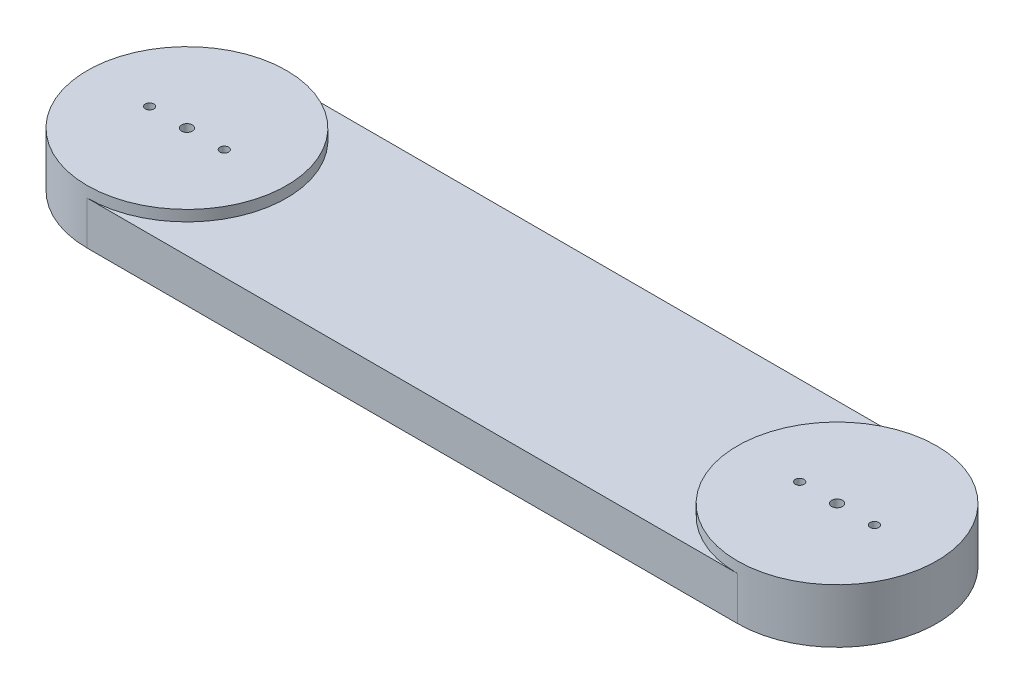
ISO-10303-21;
HEADER;
FILE_DESCRIPTION(('STEP AP214'),'2;1');
FILE_NAME('part.step','',(''),(''),'','','');
FILE_SCHEMA(('AUTOMOTIVE_DESIGN { 1 0 10303 214 1 1 1 1 }'));
ENDSEC;
DATA;
#1=APPLICATION_CONTEXT('core data for automotive mechanical design processes');
#2=APPLICATION_PROTOCOL_DEFINITION('international standard','automotive_design',2000,#1);
#3=PRODUCT_CONTEXT('',#1,'mechanical');
#4=PRODUCT('Part','Part','',(#3));
#5=PRODUCT_RELATED_PRODUCT_CATEGORY('part','',(#4));
#6=PRODUCT_DEFINITION_FORMATION('','',#4);
#7=PRODUCT_DEFINITION_CONTEXT('part definition',#1,'design');
#8=PRODUCT_DEFINITION('design','',#6,#7);
#9=PRODUCT_DEFINITION_SHAPE('','',#8);
#10=(LENGTH_UNIT() NAMED_UNIT(*) SI_UNIT(.MILLI.,.METRE.));
#11=(NAMED_UNIT(*) PLANE_ANGLE_UNIT() SI_UNIT($,.RADIAN.));
#12=(NAMED_UNIT(*) SI_UNIT($,.STERADIAN.) SOLID_ANGLE_UNIT());
#13=UNCERTAINTY_MEASURE_WITH_UNIT(LENGTH_MEASURE(1.E-05),#10,'distance_accuracy_value','');
#14=(GEOMETRIC_REPRESENTATION_CONTEXT(3) GLOBAL_UNCERTAINTY_ASSIGNED_CONTEXT((#13)) GLOBAL_UNIT_ASSIGNED_CONTEXT((#10,
#11,#12)) REPRESENTATION_CONTEXT('',''));
#15=CARTESIAN_POINT('',(0.,0.,0.));
#16=DIRECTION('',(0.,0.,1.));
#17=DIRECTION('',(1.,0.,0.));
#18=AXIS2_PLACEMENT_3D('',#15,#16,#17);
#19=CARTESIAN_POINT('',(-150.,0.,0.));
#20=DIRECTION('',(0.,1.,0.));
#21=DIRECTION('',(0.,0.,1.));
#22=AXIS2_PLACEMENT_3D('',#19,#20,#21);
#23=CYLINDRICAL_SURFACE('',#22,2.5);
#24=CARTESIAN_POINT('',(-150.,25.,0.));
#25=DIRECTION('',(0.,1.,0.));
#26=DIRECTION('',(0.,0.,1.));
#27=AXIS2_PLACEMENT_3D('',#24,#25,#26);
#28=CIRCLE('',#27,2.5);
#29=CARTESIAN_POINT('',(-150.,25.,2.49999999999997));
#30=VERTEX_POINT('',#29);
#31=EDGE_CURVE('E155',#30,#30,#28,.T.);
#32=ORIENTED_EDGE('',*,*,#31,.T.);
#33=EDGE_LOOP('',(#32));
#34=FACE_BOUND('',#33,.T.);
#35=CARTESIAN_POINT('',(-150.,6.6,0.));
#36=DIRECTION('',(0.,-1.,0.));
#37=DIRECTION('',(0.,0.,-1.));
#38=AXIS2_PLACEMENT_3D('',#35,#36,#37);
#39=CIRCLE('',#38,2.5);
#40=CARTESIAN_POINT('',(-150.,6.6,-2.50000000000002));
#41=VERTEX_POINT('',#40);
#42=EDGE_CURVE('E174',#41,#41,#39,.F.);
#43=ORIENTED_EDGE('',*,*,#42,.F.);
#44=EDGE_LOOP('',(#43));
#45=FACE_BOUND('',#44,.T.);
#46=ADVANCED_FACE('F43',(#34,#45),#23,.F.);
#47=CARTESIAN_POINT('',(-132.75,0.,0.));
#48=DIRECTION('',(0.,1.,0.));
#49=DIRECTION('',(0.,0.,1.));
#50=AXIS2_PLACEMENT_3D('',#47,#48,#49);
#51=CYLINDRICAL_SURFACE('',#50,2.);
#52=CARTESIAN_POINT('',(-132.75,25.,0.));
#53=DIRECTION('',(0.,1.,0.));
#54=DIRECTION('',(0.,0.,1.));
#55=AXIS2_PLACEMENT_3D('',#52,#53,#54);
#56=CIRCLE('',#55,2.);
#57=CARTESIAN_POINT('',(-132.75,25.,1.99999999999999));
#58=VERTEX_POINT('',#57);
#59=EDGE_CURVE('E169',#58,#58,#56,.T.);
#60=ORIENTED_EDGE('',*,*,#59,.T.);
#61=EDGE_LOOP('',(#60));
#62=FACE_BOUND('',#61,.T.);
#63=CARTESIAN_POINT('',(-132.75,6.6,0.));
#64=DIRECTION('',(0.,-1.,0.));
#65=DIRECTION('',(0.,0.,-1.));
#66=AXIS2_PLACEMENT_3D('',#63,#64,#65);
#67=CIRCLE('',#66,2.);
#68=CARTESIAN_POINT('',(-132.75,6.6,-2.));
#69=VERTEX_POINT('',#68);
#70=EDGE_CURVE('E181',#69,#69,#67,.F.);
#71=ORIENTED_EDGE('',*,*,#70,.F.);
#72=EDGE_LOOP('',(#71));
#73=FACE_BOUND('',#72,.T.);
#74=ADVANCED_FACE('F203',(#62,#73),#51,.F.);
#75=CARTESIAN_POINT('',(-167.25,0.,0.));
#76=DIRECTION('',(0.,1.,0.));
#77=DIRECTION('',(0.,0.,1.));
#78=AXIS2_PLACEMENT_3D('',#75,#76,#77);
#79=CYLINDRICAL_SURFACE('',#78,2.);
#80=CARTESIAN_POINT('',(-167.25,25.,0.));
#81=DIRECTION('',(0.,1.,0.));
#82=DIRECTION('',(0.,0.,1.));
#83=AXIS2_PLACEMENT_3D('',#80,#81,#82);
#84=CIRCLE('',#83,2.);
#85=CARTESIAN_POINT('',(-167.25,25.,2.));
#86=VERTEX_POINT('',#85);
#87=EDGE_CURVE('E170',#86,#86,#84,.T.);
#88=ORIENTED_EDGE('',*,*,#87,.T.);
#89=EDGE_LOOP('',(#88));
#90=FACE_BOUND('',#89,.T.);
#91=CARTESIAN_POINT('',(-167.25,6.6,0.));
#92=DIRECTION('',(0.,-1.,0.));
#93=DIRECTION('',(0.,0.,-1.));
#94=AXIS2_PLACEMENT_3D('',#91,#92,#93);
#95=CIRCLE('',#94,2.);
#96=CARTESIAN_POINT('',(-167.25,6.6,-2.));
#97=VERTEX_POINT('',#96);
#98=EDGE_CURVE('E47',#97,#97,#95,.F.);
#99=ORIENTED_EDGE('',*,*,#98,.F.);
#100=EDGE_LOOP('',(#99));
#101=FACE_BOUND('',#100,.T.);
#102=ADVANCED_FACE('F201',(#90,#101),#79,.F.);
#103=CARTESIAN_POINT('',(-150.,20.,-46.));
#104=DIRECTION('',(0.,0.,1.));
#105=DIRECTION('',(1.,0.,0.));
#106=AXIS2_PLACEMENT_3D('',#103,#104,#105);
#107=PLANE('',#106);
#108=DIRECTION('',(-1.,0.,0.));
#109=VECTOR('',#108,1.);
#110=CARTESIAN_POINT('',(-150.,0.,-46.));
#111=LINE('',#110,#109);
#112=CARTESIAN_POINT('',(150.,0.,-46.));
#113=VERTEX_POINT('',#112);
#114=CARTESIAN_POINT('',(-150.,0.,-46.));
#115=VERTEX_POINT('',#114);
#116=EDGE_CURVE('E96',#113,#115,#111,.T.);
#117=ORIENTED_EDGE('',*,*,#116,.T.);
#118=DIRECTION('',(0.,-1.,0.));
#119=VECTOR('',#118,1.);
#120=CARTESIAN_POINT('',(-150.,20.,-46.));
#121=LINE('',#120,#119);
#122=CARTESIAN_POINT('',(-150.,20.,-46.));
#123=VERTEX_POINT('',#122);
#124=EDGE_CURVE('E53',#123,#115,#121,.T.);
#125=ORIENTED_EDGE('',*,*,#124,.F.);
#126=DIRECTION('',(-1.,0.,0.));
#127=VECTOR('',#126,1.);
#128=CARTESIAN_POINT('',(-150.,20.,-46.));
#129=LINE('',#128,#127);
#130=CARTESIAN_POINT('',(150.,20.,-46.));
#131=VERTEX_POINT('',#130);
#132=EDGE_CURVE('E107',#131,#123,#129,.T.);
#133=ORIENTED_EDGE('',*,*,#132,.F.);
#134=DIRECTION('',(0.,-1.,0.));
#135=VECTOR('',#134,1.);
#136=CARTESIAN_POINT('',(150.,20.,-46.));
#137=LINE('',#136,#135);
#138=EDGE_CURVE('E11',#131,#113,#137,.T.);
#139=ORIENTED_EDGE('',*,*,#138,.T.);
#140=EDGE_LOOP('',(#117,#125,#133,#139));
#141=FACE_BOUND('',#140,.T.);
#142=ADVANCED_FACE('F45',(#141),#107,.F.);
#143=CARTESIAN_POINT('',(-150.,20.,46.));
#144=DIRECTION('',(0.,0.,-1.));
#145=DIRECTION('',(-1.,0.,0.));
#146=AXIS2_PLACEMENT_3D('',#143,#144,#145);
#147=PLANE('',#146);
#148=DIRECTION('',(1.,0.,0.));
#149=VECTOR('',#148,1.);
#150=CARTESIAN_POINT('',(-150.,0.,46.));
#151=LINE('',#150,#149);
#152=CARTESIAN_POINT('',(-150.,0.,46.));
#153=VERTEX_POINT('',#152);
#154=CARTESIAN_POINT('',(150.,0.,46.));
#155=VERTEX_POINT('',#154);
#156=EDGE_CURVE('E102',#153,#155,#151,.T.);
#157=ORIENTED_EDGE('',*,*,#156,.T.);
#158=DIRECTION('',(0.,-1.,0.));
#159=VECTOR('',#158,1.);
#160=CARTESIAN_POINT('',(150.,20.,46.));
#161=LINE('',#160,#159);
#162=CARTESIAN_POINT('',(150.,20.,46.));
#163=VERTEX_POINT('',#162);
#164=EDGE_CURVE('E86',#163,#155,#161,.T.);
#165=ORIENTED_EDGE('',*,*,#164,.F.);
#166=DIRECTION('',(1.,0.,0.));
#167=VECTOR('',#166,1.);
#168=CARTESIAN_POINT('',(-150.,20.,46.));
#169=LINE('',#168,#167);
#170=CARTESIAN_POINT('',(-150.,20.,46.));
#171=VERTEX_POINT('',#170);
#172=EDGE_CURVE('E110',#171,#163,#169,.T.);
#173=ORIENTED_EDGE('',*,*,#172,.F.);
#174=DIRECTION('',(0.,-1.,0.));
#175=VECTOR('',#174,1.);
#176=CARTESIAN_POINT('',(-150.,20.,46.));
#177=LINE('',#176,#175);
#178=EDGE_CURVE('E60',#171,#153,#177,.T.);
#179=ORIENTED_EDGE('',*,*,#178,.T.);
#180=EDGE_LOOP('',(#157,#165,#173,#179));
#181=FACE_BOUND('',#180,.T.);
#182=ADVANCED_FACE('F210',(#181),#147,.F.);
#183=CARTESIAN_POINT('',(0.,20.,0.));
#184=DIRECTION('',(0.,-1.,0.));
#185=DIRECTION('',(0.,0.,-1.));
#186=AXIS2_PLACEMENT_3D('',#183,#184,#185);
#187=PLANE('',#186);
#188=ORIENTED_EDGE('',*,*,#172,.T.);
#189=CARTESIAN_POINT('',(150.,20.,0.));
#190=DIRECTION('',(0.,-1.,0.));
#191=DIRECTION('',(0.,0.,-1.));
#192=AXIS2_PLACEMENT_3D('',#189,#190,#191);
#193=CIRCLE('',#192,46.);
#194=EDGE_CURVE('E91',#163,#131,#193,.T.);
#195=ORIENTED_EDGE('',*,*,#194,.T.);
#196=ORIENTED_EDGE('',*,*,#132,.T.);
#197=CARTESIAN_POINT('',(-150.,20.,0.));
#198=DIRECTION('',(0.,-1.,0.));
#199=DIRECTION('',(0.,0.,-1.));
#200=AXIS2_PLACEMENT_3D('',#197,#198,#199);
#201=CIRCLE('',#200,46.);
#202=EDGE_CURVE('E103',#123,#171,#201,.T.);
#203=ORIENTED_EDGE('',*,*,#202,.T.);
#204=EDGE_LOOP('',(#188,#195,#196,#203));
#205=FACE_BOUND('',#204,.T.);
#206=ADVANCED_FACE('F245',(#205),#187,.F.);
#207=CARTESIAN_POINT('',(0.,0.,0.));
#208=DIRECTION('',(0.,-1.,0.));
#209=DIRECTION('',(0.,0.,-1.));
#210=AXIS2_PLACEMENT_3D('',#207,#208,#209);
#211=PLANE('',#210);
#212=CARTESIAN_POINT('',(-150.,0.,0.));
#213=DIRECTION('',(0.,-1.,0.));
#214=DIRECTION('',(0.,0.,-1.));
#215=AXIS2_PLACEMENT_3D('',#212,#213,#214);
#216=CIRCLE('',#215,29.5);
#217=CARTESIAN_POINT('',(-150.,0.,-29.5));
#218=VERTEX_POINT('',#217);
#219=EDGE_CURVE('E185',#218,#218,#216,.T.);
#220=ORIENTED_EDGE('',*,*,#219,.F.);
#221=EDGE_LOOP('',(#220));
#222=FACE_BOUND('',#221,.T.);
#223=CARTESIAN_POINT('',(132.75,0.,0.));
#224=DIRECTION('',(0.,1.,0.));
#225=DIRECTION('',(0.,0.,1.));
#226=AXIS2_PLACEMENT_3D('',#223,#224,#225);
#227=CIRCLE('',#226,2.);
#228=CARTESIAN_POINT('',(132.75,0.,2.));
#229=VERTEX_POINT('',#228);
#230=EDGE_CURVE('E150',#229,#229,#227,.T.);
#231=ORIENTED_EDGE('',*,*,#230,.T.);
#232=EDGE_LOOP('',(#231));
#233=FACE_BOUND('',#232,.T.);
#234=CARTESIAN_POINT('',(167.25,0.,0.));
#235=DIRECTION('',(0.,1.,0.));
#236=DIRECTION('',(0.,0.,1.));
#237=AXIS2_PLACEMENT_3D('',#234,#235,#236);
#238=CIRCLE('',#237,2.);
#239=CARTESIAN_POINT('',(167.25,0.,1.99999999999999));
#240=VERTEX_POINT('',#239);
#241=EDGE_CURVE('E159',#240,#240,#238,.T.);
#242=ORIENTED_EDGE('',*,*,#241,.T.);
#243=EDGE_LOOP('',(#242));
#244=FACE_BOUND('',#243,.T.);
#245=CARTESIAN_POINT('',(150.,0.,0.));
#246=DIRECTION('',(0.,1.,0.));
#247=DIRECTION('',(0.,0.,1.));
#248=AXIS2_PLACEMENT_3D('',#245,#246,#247);
#249=CIRCLE('',#248,2.5);
#250=CARTESIAN_POINT('',(150.,0.,2.49999999999997));
#251=VERTEX_POINT('',#250);
#252=EDGE_CURVE('E140',#251,#251,#249,.T.);
#253=ORIENTED_EDGE('',*,*,#252,.T.);
#254=EDGE_LOOP('',(#253));
#255=FACE_BOUND('',#254,.T.);
#256=ORIENTED_EDGE('',*,*,#116,.F.);
#257=CARTESIAN_POINT('',(150.,0.,0.));
#258=DIRECTION('',(0.,-1.,0.));
#259=DIRECTION('',(0.,0.,-1.));
#260=AXIS2_PLACEMENT_3D('',#257,#258,#259);
#261=CIRCLE('',#260,46.);
#262=EDGE_CURVE('E82',#113,#155,#261,.T.);
#263=ORIENTED_EDGE('',*,*,#262,.T.);
#264=ORIENTED_EDGE('',*,*,#156,.F.);
#265=CARTESIAN_POINT('',(-150.,0.,0.));
#266=DIRECTION('',(0.,-1.,0.));
#267=DIRECTION('',(0.,0.,-1.));
#268=AXIS2_PLACEMENT_3D('',#265,#266,#267);
#269=CIRCLE('',#268,46.);
#270=EDGE_CURVE('E98',#153,#115,#269,.T.);
#271=ORIENTED_EDGE('',*,*,#270,.T.);
#272=EDGE_LOOP('',(#256,#263,#264,#271));
#273=FACE_BOUND('',#272,.T.);
#274=ADVANCED_FACE('F97',(#222,#233,#244,#255,#273),#211,.T.);
#275=CARTESIAN_POINT('',(-150.,25.,0.));
#276=DIRECTION('',(0.,-1.,0.));
#277=DIRECTION('',(0.,0.,-1.));
#278=AXIS2_PLACEMENT_3D('',#275,#276,#277);
#279=CYLINDRICAL_SURFACE('',#278,46.);
#280=CARTESIAN_POINT('',(-150.,25.,0.));
#281=DIRECTION('',(0.,-1.,0.));
#282=DIRECTION('',(0.,0.,-1.));
#283=AXIS2_PLACEMENT_3D('',#280,#281,#282);
#284=CIRCLE('',#283,46.);
#285=CARTESIAN_POINT('',(-150.,25.,-46.));
#286=VERTEX_POINT('',#285);
#287=EDGE_CURVE('E128',#286,#286,#284,.T.);
#288=ORIENTED_EDGE('',*,*,#287,.T.);
#289=EDGE_LOOP('',(#288));
#290=FACE_BOUND('',#289,.T.);
#291=ORIENTED_EDGE('',*,*,#124,.T.);
#292=ORIENTED_EDGE('',*,*,#270,.F.);
#293=ORIENTED_EDGE('',*,*,#178,.F.);
#294=ORIENTED_EDGE('',*,*,#202,.F.);
#295=EDGE_LOOP('',(#291,#292,#293,#294));
#296=FACE_BOUND('',#295,.T.);
#297=ADVANCED_FACE('F125',(#290,#296),#279,.T.);
#298=CARTESIAN_POINT('',(-150.,25.,0.));
#299=DIRECTION('',(0.,-1.,0.));
#300=DIRECTION('',(0.,0.,-1.));
#301=AXIS2_PLACEMENT_3D('',#298,#299,#300);
#302=PLANE('',#301);
#303=ORIENTED_EDGE('',*,*,#87,.F.);
#304=EDGE_LOOP('',(#303));
#305=FACE_BOUND('',#304,.T.);
#306=ORIENTED_EDGE('',*,*,#59,.F.);
#307=EDGE_LOOP('',(#306));
#308=FACE_BOUND('',#307,.T.);
#309=ORIENTED_EDGE('',*,*,#31,.F.);
#310=EDGE_LOOP('',(#309));
#311=FACE_BOUND('',#310,.T.);
#312=ORIENTED_EDGE('',*,*,#287,.F.);
#313=EDGE_LOOP('',(#312));
#314=FACE_BOUND('',#313,.T.);
#315=ADVANCED_FACE('F235',(#305,#308,#311,#314),#302,.F.);
#316=CARTESIAN_POINT('',(150.,25.,0.));
#317=DIRECTION('',(0.,-1.,0.));
#318=DIRECTION('',(0.,0.,-1.));
#319=AXIS2_PLACEMENT_3D('',#316,#317,#318);
#320=CYLINDRICAL_SURFACE('',#319,46.);
#321=CARTESIAN_POINT('',(150.,25.,0.));
#322=DIRECTION('',(0.,-1.,0.));
#323=DIRECTION('',(0.,0.,-1.));
#324=AXIS2_PLACEMENT_3D('',#321,#322,#323);
#325=CIRCLE('',#324,46.);
#326=CARTESIAN_POINT('',(150.,25.,-46.));
#327=VERTEX_POINT('',#326);
#328=EDGE_CURVE('E92',#327,#327,#325,.T.);
#329=ORIENTED_EDGE('',*,*,#328,.T.);
#330=EDGE_LOOP('',(#329));
#331=FACE_BOUND('',#330,.T.);
#332=ORIENTED_EDGE('',*,*,#138,.F.);
#333=ORIENTED_EDGE('',*,*,#194,.F.);
#334=ORIENTED_EDGE('',*,*,#164,.T.);
#335=ORIENTED_EDGE('',*,*,#262,.F.);
#336=EDGE_LOOP('',(#332,#333,#334,#335));
#337=FACE_BOUND('',#336,.T.);
#338=ADVANCED_FACE('F84',(#331,#337),#320,.T.);
#339=CARTESIAN_POINT('',(150.,25.,0.));
#340=DIRECTION('',(0.,-1.,0.));
#341=DIRECTION('',(0.,0.,-1.));
#342=AXIS2_PLACEMENT_3D('',#339,#340,#341);
#343=PLANE('',#342);
#344=CARTESIAN_POINT('',(132.75,25.,0.));
#345=DIRECTION('',(0.,1.,0.));
#346=DIRECTION('',(0.,0.,1.));
#347=AXIS2_PLACEMENT_3D('',#344,#345,#346);
#348=CIRCLE('',#347,2.);
#349=CARTESIAN_POINT('',(132.75,25.,2.));
#350=VERTEX_POINT('',#349);
#351=EDGE_CURVE('E154',#350,#350,#348,.T.);
#352=ORIENTED_EDGE('',*,*,#351,.F.);
#353=EDGE_LOOP('',(#352));
#354=FACE_BOUND('',#353,.T.);
#355=CARTESIAN_POINT('',(167.25,25.,0.));
#356=DIRECTION('',(0.,1.,0.));
#357=DIRECTION('',(0.,0.,1.));
#358=AXIS2_PLACEMENT_3D('',#355,#356,#357);
#359=CIRCLE('',#358,2.);
#360=CARTESIAN_POINT('',(167.25,25.,1.99999999999999));
#361=VERTEX_POINT('',#360);
#362=EDGE_CURVE('E146',#361,#361,#359,.T.);
#363=ORIENTED_EDGE('',*,*,#362,.F.);
#364=EDGE_LOOP('',(#363));
#365=FACE_BOUND('',#364,.T.);
#366=CARTESIAN_POINT('',(150.,25.,0.));
#367=DIRECTION('',(0.,1.,0.));
#368=DIRECTION('',(0.,0.,1.));
#369=AXIS2_PLACEMENT_3D('',#366,#367,#368);
#370=CIRCLE('',#369,2.5);
#371=CARTESIAN_POINT('',(150.,25.,2.49999999999997));
#372=VERTEX_POINT('',#371);
#373=EDGE_CURVE('E142',#372,#372,#370,.T.);
#374=ORIENTED_EDGE('',*,*,#373,.F.);
#375=EDGE_LOOP('',(#374));
#376=FACE_BOUND('',#375,.T.);
#377=ORIENTED_EDGE('',*,*,#328,.F.);
#378=EDGE_LOOP('',(#377));
#379=FACE_BOUND('',#378,.T.);
#380=ADVANCED_FACE('F231',(#354,#365,#376,#379),#343,.F.);
#381=CARTESIAN_POINT('',(150.,0.,0.));
#382=DIRECTION('',(0.,1.,0.));
#383=DIRECTION('',(0.,0.,1.));
#384=AXIS2_PLACEMENT_3D('',#381,#382,#383);
#385=CYLINDRICAL_SURFACE('',#384,2.5);
#386=ORIENTED_EDGE('',*,*,#252,.F.);
#387=EDGE_LOOP('',(#386));
#388=FACE_BOUND('',#387,.T.);
#389=ORIENTED_EDGE('',*,*,#373,.T.);
#390=EDGE_LOOP('',(#389));
#391=FACE_BOUND('',#390,.T.);
#392=ADVANCED_FACE('F224',(#388,#391),#385,.F.);
#393=CARTESIAN_POINT('',(167.25,0.,0.));
#394=DIRECTION('',(0.,1.,0.));
#395=DIRECTION('',(0.,0.,1.));
#396=AXIS2_PLACEMENT_3D('',#393,#394,#395);
#397=CYLINDRICAL_SURFACE('',#396,2.);
#398=ORIENTED_EDGE('',*,*,#241,.F.);
#399=EDGE_LOOP('',(#398));
#400=FACE_BOUND('',#399,.T.);
#401=ORIENTED_EDGE('',*,*,#362,.T.);
#402=EDGE_LOOP('',(#401));
#403=FACE_BOUND('',#402,.T.);
#404=ADVANCED_FACE('F220',(#400,#403),#397,.F.);
#405=CARTESIAN_POINT('',(132.75,0.,0.));
#406=DIRECTION('',(0.,1.,0.));
#407=DIRECTION('',(0.,0.,1.));
#408=AXIS2_PLACEMENT_3D('',#405,#406,#407);
#409=CYLINDRICAL_SURFACE('',#408,2.);
#410=ORIENTED_EDGE('',*,*,#230,.F.);
#411=EDGE_LOOP('',(#410));
#412=FACE_BOUND('',#411,.T.);
#413=ORIENTED_EDGE('',*,*,#351,.T.);
#414=EDGE_LOOP('',(#413));
#415=FACE_BOUND('',#414,.T.);
#416=ADVANCED_FACE('F223',(#412,#415),#409,.F.);
#417=CARTESIAN_POINT('',(-150.,6.6,0.));
#418=DIRECTION('',(0.,-1.,0.));
#419=DIRECTION('',(0.,0.,-1.));
#420=AXIS2_PLACEMENT_3D('',#417,#418,#419);
#421=PLANE('',#420);
#422=CARTESIAN_POINT('',(-150.,6.6,0.));
#423=DIRECTION('',(0.,-1.,0.));
#424=DIRECTION('',(0.,0.,-1.));
#425=AXIS2_PLACEMENT_3D('',#422,#423,#424);
#426=CIRCLE('',#425,29.5);
#427=CARTESIAN_POINT('',(-150.,6.6,-29.5));
#428=VERTEX_POINT('',#427);
#429=EDGE_CURVE('E189',#428,#428,#426,.T.);
#430=ORIENTED_EDGE('',*,*,#429,.T.);
#431=EDGE_LOOP('',(#430));
#432=FACE_BOUND('',#431,.T.);
#433=ORIENTED_EDGE('',*,*,#98,.T.);
#434=EDGE_LOOP('',(#433));
#435=FACE_BOUND('',#434,.T.);
#436=ORIENTED_EDGE('',*,*,#70,.T.);
#437=EDGE_LOOP('',(#436));
#438=FACE_BOUND('',#437,.T.);
#439=ORIENTED_EDGE('',*,*,#42,.T.);
#440=EDGE_LOOP('',(#439));
#441=FACE_BOUND('',#440,.T.);
#442=ADVANCED_FACE('F198',(#432,#435,#438,#441),#421,.T.);
#443=CARTESIAN_POINT('',(-150.,6.6,0.));
#444=DIRECTION('',(0.,-1.,0.));
#445=DIRECTION('',(0.,0.,-1.));
#446=AXIS2_PLACEMENT_3D('',#443,#444,#445);
#447=CYLINDRICAL_SURFACE('',#446,29.5);
#448=ORIENTED_EDGE('',*,*,#429,.F.);
#449=EDGE_LOOP('',(#448));
#450=FACE_BOUND('',#449,.T.);
#451=ORIENTED_EDGE('',*,*,#219,.T.);
#452=EDGE_LOOP('',(#451));
#453=FACE_BOUND('',#452,.T.);
#454=ADVANCED_FACE('F298',(#450,#453),#447,.F.);
#455=CLOSED_SHELL('',(#46,#74,#102,#142,#182,#206,#274,#297,#315,#338,#380,#392,#404,#416,#442,#454));
#456=MANIFOLD_SOLID_BREP('B2',#455);
#457=ADVANCED_BREP_SHAPE_REPRESENTATION('',(#18,#456),#14);
#458=SHAPE_DEFINITION_REPRESENTATION(#9,#457);
ENDSEC;
END-ISO-10303-21;
